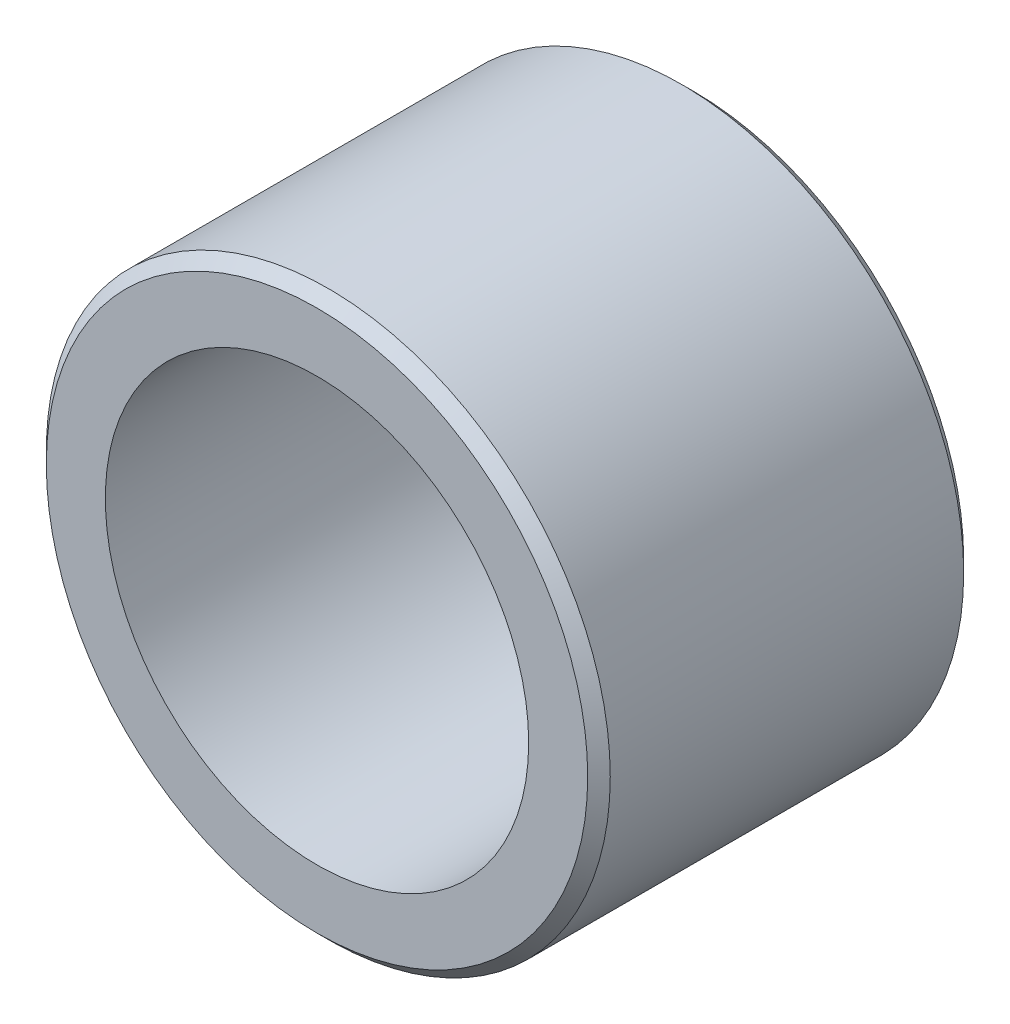
ISO-10303-21;
HEADER;
FILE_DESCRIPTION(('STEP AP214'),'2;1');
FILE_NAME('part.step','',(''),(''),'','','');
FILE_SCHEMA(('AUTOMOTIVE_DESIGN { 1 0 10303 214 1 1 1 1 }'));
ENDSEC;
DATA;
#1=APPLICATION_CONTEXT('core data for automotive mechanical design processes');
#2=APPLICATION_PROTOCOL_DEFINITION('international standard','automotive_design',2000,#1);
#3=PRODUCT_CONTEXT('',#1,'mechanical');
#4=PRODUCT('Part','Part','',(#3));
#5=PRODUCT_RELATED_PRODUCT_CATEGORY('part','',(#4));
#6=PRODUCT_DEFINITION_FORMATION('','',#4);
#7=PRODUCT_DEFINITION_CONTEXT('part definition',#1,'design');
#8=PRODUCT_DEFINITION('design','',#6,#7);
#9=PRODUCT_DEFINITION_SHAPE('','',#8);
#10=(LENGTH_UNIT() NAMED_UNIT(*) SI_UNIT(.MILLI.,.METRE.));
#11=(NAMED_UNIT(*) PLANE_ANGLE_UNIT() SI_UNIT($,.RADIAN.));
#12=(NAMED_UNIT(*) SI_UNIT($,.STERADIAN.) SOLID_ANGLE_UNIT());
#13=UNCERTAINTY_MEASURE_WITH_UNIT(LENGTH_MEASURE(1.E-05),#10,'distance_accuracy_value','');
#14=(GEOMETRIC_REPRESENTATION_CONTEXT(3) GLOBAL_UNCERTAINTY_ASSIGNED_CONTEXT((#13)) GLOBAL_UNIT_ASSIGNED_CONTEXT((#10,
#11,#12)) REPRESENTATION_CONTEXT('',''));
#15=CARTESIAN_POINT('',(0.,0.,0.));
#16=DIRECTION('',(0.,0.,1.));
#17=DIRECTION('',(1.,0.,0.));
#18=AXIS2_PLACEMENT_3D('',#15,#16,#17);
#19=CARTESIAN_POINT('',(0.,0.,6.35));
#20=DIRECTION('',(0.,0.,1.));
#21=DIRECTION('',(1.,0.,0.));
#22=AXIS2_PLACEMENT_3D('',#19,#20,#21);
#23=PLANE('',#22);
#24=CARTESIAN_POINT('',(0.,0.,6.35));
#25=DIRECTION('',(0.,0.,1.));
#26=DIRECTION('',(1.,0.,0.));
#27=AXIS2_PLACEMENT_3D('',#24,#25,#26);
#28=CIRCLE('',#27,9.144);
#29=CARTESIAN_POINT('',(9.14400000000002,0.,6.35));
#30=VERTEX_POINT('',#29);
#31=EDGE_CURVE('E10',#30,#30,#28,.T.);
#32=ORIENTED_EDGE('',*,*,#31,.T.);
#33=EDGE_LOOP('',(#32));
#34=FACE_BOUND('',#33,.T.);
#35=CARTESIAN_POINT('',(0.,0.,6.35));
#36=DIRECTION('',(0.,0.,1.));
#37=DIRECTION('',(1.,0.,0.));
#38=AXIS2_PLACEMENT_3D('',#35,#36,#37);
#39=CIRCLE('',#38,7.1501);
#40=CARTESIAN_POINT('',(7.15010000000002,0.,6.35));
#41=VERTEX_POINT('',#40);
#42=EDGE_CURVE('E54',#41,#41,#39,.T.);
#43=ORIENTED_EDGE('',*,*,#42,.F.);
#44=EDGE_LOOP('',(#43));
#45=FACE_BOUND('',#44,.T.);
#46=ADVANCED_FACE('F34',(#34,#45),#23,.T.);
#47=CARTESIAN_POINT('',(0.,0.,-6.35));
#48=DIRECTION('',(0.,0.,1.));
#49=DIRECTION('',(1.,0.,0.));
#50=AXIS2_PLACEMENT_3D('',#47,#48,#49);
#51=PLANE('',#50);
#52=CARTESIAN_POINT('',(0.,0.,-6.35));
#53=DIRECTION('',(0.,0.,1.));
#54=DIRECTION('',(1.,0.,0.));
#55=AXIS2_PLACEMENT_3D('',#52,#53,#54);
#56=CIRCLE('',#55,9.14399999999999);
#57=CARTESIAN_POINT('',(9.14399999999998,0.,-6.35000000000001));
#58=VERTEX_POINT('',#57);
#59=EDGE_CURVE('E41',#58,#58,#56,.F.);
#60=ORIENTED_EDGE('',*,*,#59,.T.);
#61=EDGE_LOOP('',(#60));
#62=FACE_BOUND('',#61,.T.);
#63=CARTESIAN_POINT('',(0.,0.,-6.35));
#64=DIRECTION('',(0.,0.,1.));
#65=DIRECTION('',(1.,0.,0.));
#66=AXIS2_PLACEMENT_3D('',#63,#64,#65);
#67=CIRCLE('',#66,7.1501);
#68=CARTESIAN_POINT('',(7.15010000000001,0.,-6.35));
#69=VERTEX_POINT('',#68);
#70=EDGE_CURVE('E55',#69,#69,#67,.T.);
#71=ORIENTED_EDGE('',*,*,#70,.T.);
#72=EDGE_LOOP('',(#71));
#73=FACE_BOUND('',#72,.T.);
#74=ADVANCED_FACE('F65',(#62,#73),#51,.F.);
#75=CARTESIAN_POINT('',(0.,0.,6.35));
#76=DIRECTION('',(0.,0.,-1.));
#77=DIRECTION('',(-1.,0.,0.));
#78=AXIS2_PLACEMENT_3D('',#75,#76,#77);
#79=CYLINDRICAL_SURFACE('',#78,9.525);
#80=CARTESIAN_POINT('',(0.,0.,-5.969));
#81=DIRECTION('',(0.,0.,1.));
#82=DIRECTION('',(1.,0.,0.));
#83=AXIS2_PLACEMENT_3D('',#80,#81,#82);
#84=CIRCLE('',#83,9.525);
#85=CARTESIAN_POINT('',(9.52499999999999,0.,-5.969));
#86=VERTEX_POINT('',#85);
#87=EDGE_CURVE('E45',#86,#86,#84,.T.);
#88=ORIENTED_EDGE('',*,*,#87,.T.);
#89=EDGE_LOOP('',(#88));
#90=FACE_BOUND('',#89,.T.);
#91=CARTESIAN_POINT('',(0.,0.,5.96899999999999));
#92=DIRECTION('',(0.,0.,1.));
#93=DIRECTION('',(1.,0.,0.));
#94=AXIS2_PLACEMENT_3D('',#91,#92,#93);
#95=CIRCLE('',#94,9.525);
#96=CARTESIAN_POINT('',(9.52500000000002,0.,5.969));
#97=VERTEX_POINT('',#96);
#98=EDGE_CURVE('E49',#97,#97,#95,.F.);
#99=ORIENTED_EDGE('',*,*,#98,.T.);
#100=EDGE_LOOP('',(#99));
#101=FACE_BOUND('',#100,.T.);
#102=ADVANCED_FACE('F70',(#90,#101),#79,.T.);
#103=CARTESIAN_POINT('',(0.,0.,6.35));
#104=DIRECTION('',(0.,0.,-1.));
#105=DIRECTION('',(-1.,0.,0.));
#106=AXIS2_PLACEMENT_3D('',#103,#104,#105);
#107=CYLINDRICAL_SURFACE('',#106,7.1501);
#108=ORIENTED_EDGE('',*,*,#42,.T.);
#109=EDGE_LOOP('',(#108));
#110=FACE_BOUND('',#109,.T.);
#111=ORIENTED_EDGE('',*,*,#70,.F.);
#112=EDGE_LOOP('',(#111));
#113=FACE_BOUND('',#112,.T.);
#114=ADVANCED_FACE('F61',(#110,#113),#107,.F.);
#115=CARTESIAN_POINT('',(0.,0.,-5.969));
#116=DIRECTION('',(0.,0.,1.));
#117=DIRECTION('',(1.,0.,0.));
#118=AXIS2_PLACEMENT_3D('',#115,#116,#117);
#119=CONICAL_SURFACE('',#118,9.525,0.785398163397451);
#120=CARTESIAN_POINT('',(9.14399999999998,0.,-6.35000000000001));
#121=CARTESIAN_POINT('',(9.14796874999998,0.,-6.34603125000001));
#122=CARTESIAN_POINT('',(9.15193749999998,0.,-6.34206250000001));
#123=CARTESIAN_POINT('',(9.15987499999998,0.,-6.33412500000001));
#124=CARTESIAN_POINT('',(9.16384374999998,0.,-6.33015625000001));
#125=CARTESIAN_POINT('',(9.17178124999998,0.,-6.32221875000001));
#126=CARTESIAN_POINT('',(9.17574999999998,0.,-6.31825000000001));
#127=CARTESIAN_POINT('',(9.18368749999998,0.,-6.31031250000001));
#128=CARTESIAN_POINT('',(9.18765624999998,0.,-6.30634375000001));
#129=CARTESIAN_POINT('',(9.19559374999998,0.,-6.29840625000001));
#130=CARTESIAN_POINT('',(9.19956249999998,0.,-6.29443750000001));
#131=CARTESIAN_POINT('',(9.20749999999998,0.,-6.28650000000001));
#132=CARTESIAN_POINT('',(9.21146874999998,0.,-6.28253125));
#133=CARTESIAN_POINT('',(9.21940624999998,0.,-6.27459375));
#134=CARTESIAN_POINT('',(9.22337499999998,0.,-6.270625));
#135=CARTESIAN_POINT('',(9.23131249999998,0.,-6.2626875));
#136=CARTESIAN_POINT('',(9.23528124999998,0.,-6.25871875));
#137=CARTESIAN_POINT('',(9.24321874999998,0.,-6.25078125));
#138=CARTESIAN_POINT('',(9.24718749999998,0.,-6.2468125));
#139=CARTESIAN_POINT('',(9.25512499999998,0.,-6.238875));
#140=CARTESIAN_POINT('',(9.25909374999999,0.,-6.23490625));
#141=CARTESIAN_POINT('',(9.26703124999998,0.,-6.22696875));
#142=CARTESIAN_POINT('',(9.27099999999998,0.,-6.223));
#143=CARTESIAN_POINT('',(9.27893749999998,0.,-6.2150625));
#144=CARTESIAN_POINT('',(9.28290624999998,0.,-6.21109375));
#145=CARTESIAN_POINT('',(9.29084374999998,0.,-6.20315625));
#146=CARTESIAN_POINT('',(9.29481249999998,0.,-6.1991875));
#147=CARTESIAN_POINT('',(9.30274999999999,0.,-6.19125));
#148=CARTESIAN_POINT('',(9.30671874999999,0.,-6.18728125));
#149=CARTESIAN_POINT('',(9.31465624999998,0.,-6.17934375));
#150=CARTESIAN_POINT('',(9.31862499999999,0.,-6.175375));
#151=CARTESIAN_POINT('',(9.32656249999999,0.,-6.1674375));
#152=CARTESIAN_POINT('',(9.33053124999999,0.,-6.16346875));
#153=CARTESIAN_POINT('',(9.33846874999998,0.,-6.15553125));
#154=CARTESIAN_POINT('',(9.34243749999999,0.,-6.1515625));
#155=CARTESIAN_POINT('',(9.35037499999999,0.,-6.143625));
#156=CARTESIAN_POINT('',(9.35434374999999,0.,-6.13965625));
#157=CARTESIAN_POINT('',(9.36228124999999,0.,-6.13171875));
#158=CARTESIAN_POINT('',(9.36624999999999,0.,-6.12775));
#159=CARTESIAN_POINT('',(9.37418749999999,0.,-6.1198125));
#160=CARTESIAN_POINT('',(9.37815624999999,0.,-6.11584375));
#161=CARTESIAN_POINT('',(9.38609374999999,0.,-6.10790625));
#162=CARTESIAN_POINT('',(9.39006249999999,0.,-6.1039375));
#163=CARTESIAN_POINT('',(9.39799999999999,0.,-6.096));
#164=CARTESIAN_POINT('',(9.40196874999999,0.,-6.09203125));
#165=CARTESIAN_POINT('',(9.40990624999999,0.,-6.08409375));
#166=CARTESIAN_POINT('',(9.41387499999999,0.,-6.080125));
#167=CARTESIAN_POINT('',(9.42181249999999,0.,-6.0721875));
#168=CARTESIAN_POINT('',(9.42578124999999,0.,-6.06821875));
#169=CARTESIAN_POINT('',(9.43371874999999,0.,-6.06028125));
#170=CARTESIAN_POINT('',(9.43768749999999,0.,-6.0563125));
#171=CARTESIAN_POINT('',(9.44562499999999,0.,-6.048375));
#172=CARTESIAN_POINT('',(9.44959374999999,0.,-6.04440625));
#173=CARTESIAN_POINT('',(9.45753124999999,0.,-6.03646875));
#174=CARTESIAN_POINT('',(9.46149999999999,0.,-6.0325));
#175=CARTESIAN_POINT('',(9.46943749999999,0.,-6.0245625));
#176=CARTESIAN_POINT('',(9.47340624999999,0.,-6.02059375));
#177=CARTESIAN_POINT('',(9.48134374999999,0.,-6.01265625));
#178=CARTESIAN_POINT('',(9.48531249999999,0.,-6.0086875));
#179=CARTESIAN_POINT('',(9.49324999999999,0.,-6.00075));
#180=CARTESIAN_POINT('',(9.49721874999999,0.,-5.99678125));
#181=CARTESIAN_POINT('',(9.50515624999999,0.,-5.98884375));
#182=CARTESIAN_POINT('',(9.50912499999999,0.,-5.984875));
#183=CARTESIAN_POINT('',(9.51706249999999,0.,-5.9769375));
#184=CARTESIAN_POINT('',(9.52103124999999,0.,-5.97296875));
#185=CARTESIAN_POINT('',(9.52499999999999,0.,-5.969));
#186=B_SPLINE_CURVE_WITH_KNOTS('',3,(#120,#121,#122,#123,#124,#125,#126,#127,#128,#129,#130,
#131,#132,#133,#134,#135,#136,#137,#138,#139,#140,#141,#142,#143,#144,#145,#146,#147,#148,#149,
#150,#151,#152,#153,#154,#155,#156,#157,#158,#159,#160,#161,#162,#163,#164,#165,#166,#167,#168,
#169,#170,#171,#172,#173,#174,#175,#176,#177,#178,#179,#180,#181,#182,#183,#184,#185),
.UNSPECIFIED.,.F.,.F.,(4,2,2,2,2,2,2,2,2,2,2,2,2,2,2,2,2,2,2,2,2,2,2,2,2,2,2,2,2,2,2,2,4),(0.,
0.0168379802270043,0.0336759604540099,0.0505139406810148,0.0673519209080204,0.0841899011350253,
0.10102788136203,0.117865861589035,0.13470384181604,0.151541822043045,0.168379802270051,
0.185217782497054,0.20205576272406,0.218893742951065,0.23573172317807,0.252569703405075,
0.26940768363208,0.286245663859085,0.30308364408609,0.319921624313096,0.336759604540101,
0.353597584767105,0.37043556499411,0.387273545221116,0.40411152544812,0.420949505675126,
0.43778748590213,0.454625466129135,0.47146344635614,0.488301426583146,0.505139406810151,
0.521977387037155,0.538815367264161),.UNSPECIFIED.);
#187=EDGE_CURVE('BSEAM76',#58,#86,#186,.T.);
#188=ORIENTED_EDGE('',*,*,#59,.F.);
#189=ORIENTED_EDGE('',*,*,#87,.F.);
#190=ORIENTED_EDGE('',*,*,#187,.T.);
#191=ORIENTED_EDGE('',*,*,#187,.F.);
#192=EDGE_LOOP('',(#188,#190,#189,#191));
#193=FACE_BOUND('',#192,.T.);
#194=ADVANCED_FACE('F76',(#193),#119,.T.);
#195=CARTESIAN_POINT('',(0.,0.,6.35));
#196=DIRECTION('',(0.,0.,-1.));
#197=DIRECTION('',(-1.,0.,0.));
#198=AXIS2_PLACEMENT_3D('',#195,#196,#197);
#199=CONICAL_SURFACE('',#198,9.144,0.785398163397442);
#200=ORIENTED_EDGE('',*,*,#98,.F.);
#201=EDGE_LOOP('',(#200));
#202=FACE_BOUND('',#201,.T.);
#203=ORIENTED_EDGE('',*,*,#31,.F.);
#204=EDGE_LOOP('',(#203));
#205=FACE_BOUND('',#204,.T.);
#206=ADVANCED_FACE('F36',(#202,#205),#199,.T.);
#207=CLOSED_SHELL('',(#46,#74,#102,#114,#194,#206));
#208=MANIFOLD_SOLID_BREP('B2',#207);
#209=ADVANCED_BREP_SHAPE_REPRESENTATION('',(#18,#208),#14);
#210=SHAPE_DEFINITION_REPRESENTATION(#9,#209);
ENDSEC;
END-ISO-10303-21;
